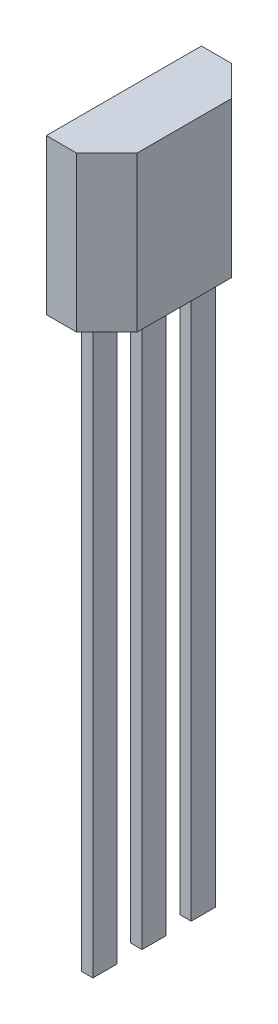
ISO-10303-21;
HEADER;
FILE_DESCRIPTION(('STEP AP214'),'2;1');
FILE_NAME('part.step','',(''),(''),'','','');
FILE_SCHEMA(('AUTOMOTIVE_DESIGN { 1 0 10303 214 1 1 1 1 }'));
ENDSEC;
DATA;
#1=APPLICATION_CONTEXT('core data for automotive mechanical design processes');
#2=APPLICATION_PROTOCOL_DEFINITION('international standard','automotive_design',2000,#1);
#3=PRODUCT_CONTEXT('',#1,'mechanical');
#4=PRODUCT('Part','Part','',(#3));
#5=PRODUCT_RELATED_PRODUCT_CATEGORY('part','',(#4));
#6=PRODUCT_DEFINITION_FORMATION('','',#4);
#7=PRODUCT_DEFINITION_CONTEXT('part definition',#1,'design');
#8=PRODUCT_DEFINITION('design','',#6,#7);
#9=PRODUCT_DEFINITION_SHAPE('','',#8);
#10=(LENGTH_UNIT() NAMED_UNIT(*) SI_UNIT(.MILLI.,.METRE.));
#11=(NAMED_UNIT(*) PLANE_ANGLE_UNIT() SI_UNIT($,.RADIAN.));
#12=(NAMED_UNIT(*) SI_UNIT($,.STERADIAN.) SOLID_ANGLE_UNIT());
#13=UNCERTAINTY_MEASURE_WITH_UNIT(LENGTH_MEASURE(1.E-05),#10,'distance_accuracy_value','');
#14=(GEOMETRIC_REPRESENTATION_CONTEXT(3) GLOBAL_UNCERTAINTY_ASSIGNED_CONTEXT((#13)) GLOBAL_UNIT_ASSIGNED_CONTEXT((#10,
#11,#12)) REPRESENTATION_CONTEXT('',''));
#15=CARTESIAN_POINT('',(0.,0.,0.));
#16=DIRECTION('',(0.,0.,1.));
#17=DIRECTION('',(1.,0.,0.));
#18=AXIS2_PLACEMENT_3D('',#15,#16,#17);
#19=CARTESIAN_POINT('',(0.,-1.7,0.));
#20=DIRECTION('',(0.,1.,0.));
#21=DIRECTION('',(0.,0.,1.));
#22=AXIS2_PLACEMENT_3D('',#19,#20,#21);
#23=PLANE('',#22);
#24=DIRECTION('',(1.,0.,0.));
#25=VECTOR('',#24,1.);
#26=CARTESIAN_POINT('',(0.499999999999996,-1.7,0.98));
#27=LINE('',#26,#25);
#28=CARTESIAN_POINT('',(0.499999999999996,-1.7,0.98));
#29=VERTEX_POINT('',#28);
#30=CARTESIAN_POINT('',(0.799999999999996,-1.7,0.98));
#31=VERTEX_POINT('',#30);
#32=EDGE_CURVE('E180',#29,#31,#27,.T.);
#33=ORIENTED_EDGE('',*,*,#32,.F.);
#34=DIRECTION('',(0.,0.,-1.));
#35=VECTOR('',#34,1.);
#36=CARTESIAN_POINT('',(0.499999999999996,-1.7,1.62));
#37=LINE('',#36,#35);
#38=CARTESIAN_POINT('',(0.499999999999996,-1.7,1.62));
#39=VERTEX_POINT('',#38);
#40=EDGE_CURVE('E193',#39,#29,#37,.T.);
#41=ORIENTED_EDGE('',*,*,#40,.F.);
#42=DIRECTION('',(-1.,0.,0.));
#43=VECTOR('',#42,1.);
#44=CARTESIAN_POINT('',(0.499999999999996,-1.7,1.62));
#45=LINE('',#44,#43);
#46=CARTESIAN_POINT('',(0.799999999999996,-1.7,1.62));
#47=VERTEX_POINT('',#46);
#48=EDGE_CURVE('E202',#47,#39,#45,.T.);
#49=ORIENTED_EDGE('',*,*,#48,.F.);
#50=DIRECTION('',(0.,0.,1.));
#51=VECTOR('',#50,1.);
#52=CARTESIAN_POINT('',(0.799999999999996,-1.7,1.62));
#53=LINE('',#52,#51);
#54=EDGE_CURVE('E183',#31,#47,#53,.T.);
#55=ORIENTED_EDGE('',*,*,#54,.F.);
#56=EDGE_LOOP('',(#33,#41,#49,#55));
#57=FACE_BOUND('',#56,.T.);
#58=DIRECTION('',(0.,0.,1.));
#59=VECTOR('',#58,1.);
#60=CARTESIAN_POINT('',(0.,-1.7,-2.05));
#61=LINE('',#60,#59);
#62=CARTESIAN_POINT('',(0.,-1.7,-2.05));
#63=VERTEX_POINT('',#62);
#64=CARTESIAN_POINT('',(0.,-1.7,2.05));
#65=VERTEX_POINT('',#64);
#66=EDGE_CURVE('E269',#63,#65,#61,.T.);
#67=ORIENTED_EDGE('',*,*,#66,.F.);
#68=DIRECTION('',(-1.,0.,0.));
#69=VECTOR('',#68,1.);
#70=CARTESIAN_POINT('',(0.,-1.7,-2.05));
#71=LINE('',#70,#69);
#72=CARTESIAN_POINT('',(0.799999999999996,-1.7,-2.05));
#73=VERTEX_POINT('',#72);
#74=EDGE_CURVE('E284',#73,#63,#71,.T.);
#75=ORIENTED_EDGE('',*,*,#74,.F.);
#76=DIRECTION('',(-0.707106781186549,0.,-0.707106781186546));
#77=VECTOR('',#76,1.);
#78=CARTESIAN_POINT('',(0.799999999999996,-1.7,-2.05));
#79=LINE('',#78,#77);
#80=CARTESIAN_POINT('',(1.6,-1.7,-1.25));
#81=VERTEX_POINT('',#80);
#82=EDGE_CURVE('E281',#81,#73,#79,.T.);
#83=ORIENTED_EDGE('',*,*,#82,.F.);
#84=DIRECTION('',(0.,0.,-1.));
#85=VECTOR('',#84,1.);
#86=CARTESIAN_POINT('',(1.6,-1.7,-1.25));
#87=LINE('',#86,#85);
#88=CARTESIAN_POINT('',(1.6,-1.7,1.25));
#89=VERTEX_POINT('',#88);
#90=EDGE_CURVE('E278',#89,#81,#87,.T.);
#91=ORIENTED_EDGE('',*,*,#90,.F.);
#92=DIRECTION('',(0.707106781186549,0.,-0.707106781186547));
#93=VECTOR('',#92,1.);
#94=CARTESIAN_POINT('',(1.6,-1.7,1.25));
#95=LINE('',#94,#93);
#96=CARTESIAN_POINT('',(0.799999999999997,-1.7,2.05));
#97=VERTEX_POINT('',#96);
#98=EDGE_CURVE('E275',#97,#89,#95,.T.);
#99=ORIENTED_EDGE('',*,*,#98,.F.);
#100=DIRECTION('',(1.,0.,0.));
#101=VECTOR('',#100,1.);
#102=CARTESIAN_POINT('',(0.,-1.7,2.05));
#103=LINE('',#102,#101);
#104=EDGE_CURVE('E272',#65,#97,#103,.T.);
#105=ORIENTED_EDGE('',*,*,#104,.F.);
#106=EDGE_LOOP('',(#67,#75,#83,#91,#99,#105));
#107=FACE_BOUND('',#106,.T.);
#108=DIRECTION('',(0.,0.,1.));
#109=VECTOR('',#108,1.);
#110=CARTESIAN_POINT('',(0.799999999999996,-1.7,0.32));
#111=LINE('',#110,#109);
#112=CARTESIAN_POINT('',(0.799999999999996,-1.7,-0.32));
#113=VERTEX_POINT('',#112);
#114=CARTESIAN_POINT('',(0.799999999999996,-1.7,0.32));
#115=VERTEX_POINT('',#114);
#116=EDGE_CURVE('E218',#113,#115,#111,.T.);
#117=ORIENTED_EDGE('',*,*,#116,.F.);
#118=DIRECTION('',(1.,0.,0.));
#119=VECTOR('',#118,1.);
#120=CARTESIAN_POINT('',(0.499999999999996,-1.7,-0.32));
#121=LINE('',#120,#119);
#122=CARTESIAN_POINT('',(0.499999999999996,-1.7,-0.32));
#123=VERTEX_POINT('',#122);
#124=EDGE_CURVE('E223',#123,#113,#121,.T.);
#125=ORIENTED_EDGE('',*,*,#124,.F.);
#126=DIRECTION('',(0.,0.,-1.));
#127=VECTOR('',#126,1.);
#128=CARTESIAN_POINT('',(0.499999999999996,-1.7,0.32));
#129=LINE('',#128,#127);
#130=CARTESIAN_POINT('',(0.499999999999996,-1.7,0.32));
#131=VERTEX_POINT('',#130);
#132=EDGE_CURVE('E235',#131,#123,#129,.T.);
#133=ORIENTED_EDGE('',*,*,#132,.F.);
#134=DIRECTION('',(-1.,0.,0.));
#135=VECTOR('',#134,1.);
#136=CARTESIAN_POINT('',(0.499999999999996,-1.7,0.32));
#137=LINE('',#136,#135);
#138=EDGE_CURVE('E232',#115,#131,#137,.T.);
#139=ORIENTED_EDGE('',*,*,#138,.F.);
#140=EDGE_LOOP('',(#117,#125,#133,#139));
#141=FACE_BOUND('',#140,.T.);
#142=DIRECTION('',(1.,0.,0.));
#143=VECTOR('',#142,1.);
#144=CARTESIAN_POINT('',(0.499999999999996,-1.7,-1.62));
#145=LINE('',#144,#143);
#146=CARTESIAN_POINT('',(0.499999999999996,-1.7,-1.62));
#147=VERTEX_POINT('',#146);
#148=CARTESIAN_POINT('',(0.799999999999996,-1.7,-1.62));
#149=VERTEX_POINT('',#148);
#150=EDGE_CURVE('E179',#147,#149,#145,.T.);
#151=ORIENTED_EDGE('',*,*,#150,.F.);
#152=DIRECTION('',(0.,0.,-1.));
#153=VECTOR('',#152,1.);
#154=CARTESIAN_POINT('',(0.499999999999996,-1.7,-0.98));
#155=LINE('',#154,#153);
#156=CARTESIAN_POINT('',(0.499999999999996,-1.7,-0.98));
#157=VERTEX_POINT('',#156);
#158=EDGE_CURVE('E176',#157,#147,#155,.T.);
#159=ORIENTED_EDGE('',*,*,#158,.F.);
#160=DIRECTION('',(-1.,0.,0.));
#161=VECTOR('',#160,1.);
#162=CARTESIAN_POINT('',(0.499999999999996,-1.7,-0.98));
#163=LINE('',#162,#161);
#164=CARTESIAN_POINT('',(0.799999999999996,-1.7,-0.98));
#165=VERTEX_POINT('',#164);
#166=EDGE_CURVE('E55',#165,#157,#163,.T.);
#167=ORIENTED_EDGE('',*,*,#166,.F.);
#168=DIRECTION('',(0.,0.,1.));
#169=VECTOR('',#168,1.);
#170=CARTESIAN_POINT('',(0.799999999999996,-1.7,-0.98));
#171=LINE('',#170,#169);
#172=EDGE_CURVE('E50',#149,#165,#171,.T.);
#173=ORIENTED_EDGE('',*,*,#172,.F.);
#174=EDGE_LOOP('',(#151,#159,#167,#173));
#175=FACE_BOUND('',#174,.T.);
#176=ADVANCED_FACE('F33',(#57,#107,#141,#175),#23,.F.);
#177=CARTESIAN_POINT('',(0.,-1.7,-2.05));
#178=DIRECTION('',(-1.,0.,0.));
#179=DIRECTION('',(0.,0.,1.));
#180=AXIS2_PLACEMENT_3D('',#177,#178,#179);
#181=PLANE('',#180);
#182=DIRECTION('',(0.,1.,0.));
#183=VECTOR('',#182,1.);
#184=CARTESIAN_POINT('',(0.,-1.7,2.05));
#185=LINE('',#184,#183);
#186=CARTESIAN_POINT('',(0.,2.4,2.05));
#187=VERTEX_POINT('',#186);
#188=EDGE_CURVE('E37',#65,#187,#185,.T.);
#189=ORIENTED_EDGE('',*,*,#188,.T.);
#190=DIRECTION('',(0.,0.,1.));
#191=VECTOR('',#190,1.);
#192=CARTESIAN_POINT('',(0.,2.4,-2.05));
#193=LINE('',#192,#191);
#194=CARTESIAN_POINT('',(0.,2.4,-2.05));
#195=VERTEX_POINT('',#194);
#196=EDGE_CURVE('E251',#195,#187,#193,.T.);
#197=ORIENTED_EDGE('',*,*,#196,.F.);
#198=DIRECTION('',(0.,1.,0.));
#199=VECTOR('',#198,1.);
#200=CARTESIAN_POINT('',(0.,-1.7,-2.05));
#201=LINE('',#200,#199);
#202=EDGE_CURVE('E11',#63,#195,#201,.T.);
#203=ORIENTED_EDGE('',*,*,#202,.F.);
#204=ORIENTED_EDGE('',*,*,#66,.T.);
#205=EDGE_LOOP('',(#189,#197,#203,#204));
#206=FACE_BOUND('',#205,.T.);
#207=ADVANCED_FACE('F35',(#206),#181,.T.);
#208=CARTESIAN_POINT('',(0.,-1.7,-2.05));
#209=DIRECTION('',(0.,0.,-1.));
#210=DIRECTION('',(-1.,0.,0.));
#211=AXIS2_PLACEMENT_3D('',#208,#209,#210);
#212=PLANE('',#211);
#213=ORIENTED_EDGE('',*,*,#202,.T.);
#214=DIRECTION('',(-1.,0.,0.));
#215=VECTOR('',#214,1.);
#216=CARTESIAN_POINT('',(0.,2.4,-2.05));
#217=LINE('',#216,#215);
#218=CARTESIAN_POINT('',(0.799999999999996,2.4,-2.05));
#219=VERTEX_POINT('',#218);
#220=EDGE_CURVE('E266',#219,#195,#217,.T.);
#221=ORIENTED_EDGE('',*,*,#220,.F.);
#222=DIRECTION('',(0.,1.,0.));
#223=VECTOR('',#222,1.);
#224=CARTESIAN_POINT('',(0.799999999999996,-1.7,-2.05));
#225=LINE('',#224,#223);
#226=EDGE_CURVE('E42',#73,#219,#225,.T.);
#227=ORIENTED_EDGE('',*,*,#226,.F.);
#228=ORIENTED_EDGE('',*,*,#74,.T.);
#229=EDGE_LOOP('',(#213,#221,#227,#228));
#230=FACE_BOUND('',#229,.T.);
#231=ADVANCED_FACE('F305',(#230),#212,.T.);
#232=CARTESIAN_POINT('',(0.799999999999996,-1.7,-2.05));
#233=DIRECTION('',(0.707106781186546,0.,-0.707106781186549));
#234=DIRECTION('',(-0.707106781186549,0.,-0.707106781186546));
#235=AXIS2_PLACEMENT_3D('',#232,#233,#234);
#236=PLANE('',#235);
#237=ORIENTED_EDGE('',*,*,#226,.T.);
#238=DIRECTION('',(-0.707106781186549,0.,-0.707106781186546));
#239=VECTOR('',#238,1.);
#240=CARTESIAN_POINT('',(0.799999999999996,2.4,-2.05));
#241=LINE('',#240,#239);
#242=CARTESIAN_POINT('',(1.6,2.4,-1.25));
#243=VERTEX_POINT('',#242);
#244=EDGE_CURVE('E263',#243,#219,#241,.T.);
#245=ORIENTED_EDGE('',*,*,#244,.F.);
#246=DIRECTION('',(0.,1.,0.));
#247=VECTOR('',#246,1.);
#248=CARTESIAN_POINT('',(1.6,-1.7,-1.25));
#249=LINE('',#248,#247);
#250=EDGE_CURVE('E288',#81,#243,#249,.T.);
#251=ORIENTED_EDGE('',*,*,#250,.F.);
#252=ORIENTED_EDGE('',*,*,#82,.T.);
#253=EDGE_LOOP('',(#237,#245,#251,#252));
#254=FACE_BOUND('',#253,.T.);
#255=ADVANCED_FACE('F318',(#254),#236,.T.);
#256=CARTESIAN_POINT('',(1.6,-1.7,-1.25));
#257=DIRECTION('',(1.,0.,0.));
#258=DIRECTION('',(0.,0.,-1.));
#259=AXIS2_PLACEMENT_3D('',#256,#257,#258);
#260=PLANE('',#259);
#261=ORIENTED_EDGE('',*,*,#250,.T.);
#262=DIRECTION('',(0.,0.,-1.));
#263=VECTOR('',#262,1.);
#264=CARTESIAN_POINT('',(1.6,2.4,-1.25));
#265=LINE('',#264,#263);
#266=CARTESIAN_POINT('',(1.6,2.4,1.25));
#267=VERTEX_POINT('',#266);
#268=EDGE_CURVE('E260',#267,#243,#265,.T.);
#269=ORIENTED_EDGE('',*,*,#268,.F.);
#270=DIRECTION('',(0.,1.,0.));
#271=VECTOR('',#270,1.);
#272=CARTESIAN_POINT('',(1.6,-1.7,1.25));
#273=LINE('',#272,#271);
#274=EDGE_CURVE('E290',#89,#267,#273,.T.);
#275=ORIENTED_EDGE('',*,*,#274,.F.);
#276=ORIENTED_EDGE('',*,*,#90,.T.);
#277=EDGE_LOOP('',(#261,#269,#275,#276));
#278=FACE_BOUND('',#277,.T.);
#279=ADVANCED_FACE('F316',(#278),#260,.T.);
#280=CARTESIAN_POINT('',(1.6,-1.7,1.25));
#281=DIRECTION('',(0.707106781186547,0.,0.707106781186548));
#282=DIRECTION('',(0.707106781186548,0.,-0.707106781186547));
#283=AXIS2_PLACEMENT_3D('',#280,#281,#282);
#284=PLANE('',#283);
#285=ORIENTED_EDGE('',*,*,#274,.T.);
#286=DIRECTION('',(0.707106781186549,0.,-0.707106781186547));
#287=VECTOR('',#286,1.);
#288=CARTESIAN_POINT('',(1.6,2.4,1.25));
#289=LINE('',#288,#287);
#290=CARTESIAN_POINT('',(0.799999999999997,2.4,2.05));
#291=VERTEX_POINT('',#290);
#292=EDGE_CURVE('E257',#291,#267,#289,.T.);
#293=ORIENTED_EDGE('',*,*,#292,.F.);
#294=DIRECTION('',(0.,1.,0.));
#295=VECTOR('',#294,1.);
#296=CARTESIAN_POINT('',(0.799999999999997,-1.7,2.05));
#297=LINE('',#296,#295);
#298=EDGE_CURVE('E291',#97,#291,#297,.T.);
#299=ORIENTED_EDGE('',*,*,#298,.F.);
#300=ORIENTED_EDGE('',*,*,#98,.T.);
#301=EDGE_LOOP('',(#285,#293,#299,#300));
#302=FACE_BOUND('',#301,.T.);
#303=ADVANCED_FACE('F313',(#302),#284,.T.);
#304=CARTESIAN_POINT('',(0.,-1.7,2.05));
#305=DIRECTION('',(0.,0.,1.));
#306=DIRECTION('',(1.,0.,0.));
#307=AXIS2_PLACEMENT_3D('',#304,#305,#306);
#308=PLANE('',#307);
#309=ORIENTED_EDGE('',*,*,#298,.T.);
#310=DIRECTION('',(1.,0.,0.));
#311=VECTOR('',#310,1.);
#312=CARTESIAN_POINT('',(0.,2.4,2.05));
#313=LINE('',#312,#311);
#314=EDGE_CURVE('E254',#187,#291,#313,.T.);
#315=ORIENTED_EDGE('',*,*,#314,.F.);
#316=ORIENTED_EDGE('',*,*,#188,.F.);
#317=ORIENTED_EDGE('',*,*,#104,.T.);
#318=EDGE_LOOP('',(#309,#315,#316,#317));
#319=FACE_BOUND('',#318,.T.);
#320=ADVANCED_FACE('F298',(#319),#308,.T.);
#321=CARTESIAN_POINT('',(0.,2.4,0.));
#322=DIRECTION('',(0.,1.,0.));
#323=DIRECTION('',(0.,0.,1.));
#324=AXIS2_PLACEMENT_3D('',#321,#322,#323);
#325=PLANE('',#324);
#326=ORIENTED_EDGE('',*,*,#196,.T.);
#327=ORIENTED_EDGE('',*,*,#314,.T.);
#328=ORIENTED_EDGE('',*,*,#292,.T.);
#329=ORIENTED_EDGE('',*,*,#268,.T.);
#330=ORIENTED_EDGE('',*,*,#244,.T.);
#331=ORIENTED_EDGE('',*,*,#220,.T.);
#332=EDGE_LOOP('',(#326,#327,#328,#329,#330,#331));
#333=FACE_BOUND('',#332,.T.);
#334=ADVANCED_FACE('F301',(#333),#325,.T.);
#335=CARTESIAN_POINT('',(0.799999999999996,-16.7,0.32));
#336=DIRECTION('',(-1.,0.,0.));
#337=DIRECTION('',(0.,0.,1.));
#338=AXIS2_PLACEMENT_3D('',#335,#336,#337);
#339=PLANE('',#338);
#340=ORIENTED_EDGE('',*,*,#116,.T.);
#341=DIRECTION('',(0.,1.,0.));
#342=VECTOR('',#341,1.);
#343=CARTESIAN_POINT('',(0.799999999999996,-16.7,0.32));
#344=LINE('',#343,#342);
#345=CARTESIAN_POINT('',(0.799999999999996,-16.7,0.32));
#346=VERTEX_POINT('',#345);
#347=EDGE_CURVE('E248',#346,#115,#344,.T.);
#348=ORIENTED_EDGE('',*,*,#347,.F.);
#349=DIRECTION('',(0.,0.,1.));
#350=VECTOR('',#349,1.);
#351=CARTESIAN_POINT('',(0.799999999999996,-16.7,0.32));
#352=LINE('',#351,#350);
#353=CARTESIAN_POINT('',(0.799999999999996,-16.7,-0.32));
#354=VERTEX_POINT('',#353);
#355=EDGE_CURVE('E219',#354,#346,#352,.T.);
#356=ORIENTED_EDGE('',*,*,#355,.F.);
#357=DIRECTION('',(0.,1.,0.));
#358=VECTOR('',#357,1.);
#359=CARTESIAN_POINT('',(0.799999999999996,-16.7,-0.32));
#360=LINE('',#359,#358);
#361=EDGE_CURVE('E229',#354,#113,#360,.T.);
#362=ORIENTED_EDGE('',*,*,#361,.T.);
#363=EDGE_LOOP('',(#340,#348,#356,#362));
#364=FACE_BOUND('',#363,.T.);
#365=ADVANCED_FACE('F336',(#364),#339,.F.);
#366=CARTESIAN_POINT('',(0.499999999999996,-16.7,0.32));
#367=DIRECTION('',(0.,0.,-1.));
#368=DIRECTION('',(-1.,0.,0.));
#369=AXIS2_PLACEMENT_3D('',#366,#367,#368);
#370=PLANE('',#369);
#371=ORIENTED_EDGE('',*,*,#138,.T.);
#372=DIRECTION('',(0.,1.,0.));
#373=VECTOR('',#372,1.);
#374=CARTESIAN_POINT('',(0.499999999999996,-16.7,0.32));
#375=LINE('',#374,#373);
#376=CARTESIAN_POINT('',(0.499999999999996,-16.7,0.32));
#377=VERTEX_POINT('',#376);
#378=EDGE_CURVE('E245',#377,#131,#375,.T.);
#379=ORIENTED_EDGE('',*,*,#378,.F.);
#380=DIRECTION('',(-1.,0.,0.));
#381=VECTOR('',#380,1.);
#382=CARTESIAN_POINT('',(0.499999999999996,-16.7,0.32));
#383=LINE('',#382,#381);
#384=EDGE_CURVE('E222',#346,#377,#383,.T.);
#385=ORIENTED_EDGE('',*,*,#384,.F.);
#386=ORIENTED_EDGE('',*,*,#347,.T.);
#387=EDGE_LOOP('',(#371,#379,#385,#386));
#388=FACE_BOUND('',#387,.T.);
#389=ADVANCED_FACE('F339',(#388),#370,.F.);
#390=CARTESIAN_POINT('',(0.499999999999996,-16.7,0.32));
#391=DIRECTION('',(1.,0.,0.));
#392=DIRECTION('',(0.,0.,-1.));
#393=AXIS2_PLACEMENT_3D('',#390,#391,#392);
#394=PLANE('',#393);
#395=ORIENTED_EDGE('',*,*,#132,.T.);
#396=DIRECTION('',(0.,1.,0.));
#397=VECTOR('',#396,1.);
#398=CARTESIAN_POINT('',(0.499999999999996,-16.7,-0.32));
#399=LINE('',#398,#397);
#400=CARTESIAN_POINT('',(0.499999999999996,-16.7,-0.32));
#401=VERTEX_POINT('',#400);
#402=EDGE_CURVE('E242',#401,#123,#399,.T.);
#403=ORIENTED_EDGE('',*,*,#402,.F.);
#404=DIRECTION('',(0.,0.,-1.));
#405=VECTOR('',#404,1.);
#406=CARTESIAN_POINT('',(0.499999999999996,-16.7,0.32));
#407=LINE('',#406,#405);
#408=EDGE_CURVE('E225',#377,#401,#407,.T.);
#409=ORIENTED_EDGE('',*,*,#408,.F.);
#410=ORIENTED_EDGE('',*,*,#378,.T.);
#411=EDGE_LOOP('',(#395,#403,#409,#410));
#412=FACE_BOUND('',#411,.T.);
#413=ADVANCED_FACE('F343',(#412),#394,.F.);
#414=CARTESIAN_POINT('',(0.499999999999996,-16.7,-0.32));
#415=DIRECTION('',(0.,0.,1.));
#416=DIRECTION('',(1.,0.,0.));
#417=AXIS2_PLACEMENT_3D('',#414,#415,#416);
#418=PLANE('',#417);
#419=ORIENTED_EDGE('',*,*,#124,.T.);
#420=ORIENTED_EDGE('',*,*,#361,.F.);
#421=DIRECTION('',(1.,0.,0.));
#422=VECTOR('',#421,1.);
#423=CARTESIAN_POINT('',(0.499999999999996,-16.7,-0.32));
#424=LINE('',#423,#422);
#425=EDGE_CURVE('E227',#401,#354,#424,.T.);
#426=ORIENTED_EDGE('',*,*,#425,.F.);
#427=ORIENTED_EDGE('',*,*,#402,.T.);
#428=EDGE_LOOP('',(#419,#420,#426,#427));
#429=FACE_BOUND('',#428,.T.);
#430=ADVANCED_FACE('F347',(#429),#418,.F.);
#431=CARTESIAN_POINT('',(0.,-16.7,0.));
#432=DIRECTION('',(0.,-1.,0.));
#433=DIRECTION('',(0.,0.,-1.));
#434=AXIS2_PLACEMENT_3D('',#431,#432,#433);
#435=PLANE('',#434);
#436=ORIENTED_EDGE('',*,*,#355,.T.);
#437=ORIENTED_EDGE('',*,*,#384,.T.);
#438=ORIENTED_EDGE('',*,*,#408,.T.);
#439=ORIENTED_EDGE('',*,*,#425,.T.);
#440=EDGE_LOOP('',(#436,#437,#438,#439));
#441=FACE_BOUND('',#440,.T.);
#442=ADVANCED_FACE('F351',(#441),#435,.T.);
#443=CARTESIAN_POINT('',(0.499999999999996,-16.7,0.98));
#444=DIRECTION('',(0.,0.,1.));
#445=DIRECTION('',(1.,0.,0.));
#446=AXIS2_PLACEMENT_3D('',#443,#444,#445);
#447=PLANE('',#446);
#448=ORIENTED_EDGE('',*,*,#32,.T.);
#449=DIRECTION('',(0.,1.,0.));
#450=VECTOR('',#449,1.);
#451=CARTESIAN_POINT('',(0.799999999999996,-16.7,0.98));
#452=LINE('',#451,#450);
#453=CARTESIAN_POINT('',(0.799999999999996,-16.7,0.98));
#454=VERTEX_POINT('',#453);
#455=EDGE_CURVE('E215',#454,#31,#452,.T.);
#456=ORIENTED_EDGE('',*,*,#455,.F.);
#457=DIRECTION('',(1.,0.,0.));
#458=VECTOR('',#457,1.);
#459=CARTESIAN_POINT('',(0.499999999999996,-16.7,0.98));
#460=LINE('',#459,#458);
#461=CARTESIAN_POINT('',(0.499999999999996,-16.7,0.98));
#462=VERTEX_POINT('',#461);
#463=EDGE_CURVE('E189',#462,#454,#460,.T.);
#464=ORIENTED_EDGE('',*,*,#463,.F.);
#465=DIRECTION('',(0.,1.,0.));
#466=VECTOR('',#465,1.);
#467=CARTESIAN_POINT('',(0.499999999999996,-16.7,0.98));
#468=LINE('',#467,#466);
#469=EDGE_CURVE('E198',#462,#29,#468,.T.);
#470=ORIENTED_EDGE('',*,*,#469,.T.);
#471=EDGE_LOOP('',(#448,#456,#464,#470));
#472=FACE_BOUND('',#471,.T.);
#473=ADVANCED_FACE('F355',(#472),#447,.F.);
#474=CARTESIAN_POINT('',(0.799999999999996,-16.7,1.62));
#475=DIRECTION('',(-1.,0.,0.));
#476=DIRECTION('',(0.,0.,1.));
#477=AXIS2_PLACEMENT_3D('',#474,#475,#476);
#478=PLANE('',#477);
#479=ORIENTED_EDGE('',*,*,#54,.T.);
#480=DIRECTION('',(0.,1.,0.));
#481=VECTOR('',#480,1.);
#482=CARTESIAN_POINT('',(0.799999999999996,-16.7,1.62));
#483=LINE('',#482,#481);
#484=CARTESIAN_POINT('',(0.799999999999996,-16.7,1.62));
#485=VERTEX_POINT('',#484);
#486=EDGE_CURVE('E212',#485,#47,#483,.T.);
#487=ORIENTED_EDGE('',*,*,#486,.F.);
#488=DIRECTION('',(0.,0.,1.));
#489=VECTOR('',#488,1.);
#490=CARTESIAN_POINT('',(0.799999999999996,-16.7,1.62));
#491=LINE('',#490,#489);
#492=EDGE_CURVE('E192',#454,#485,#491,.T.);
#493=ORIENTED_EDGE('',*,*,#492,.F.);
#494=ORIENTED_EDGE('',*,*,#455,.T.);
#495=EDGE_LOOP('',(#479,#487,#493,#494));
#496=FACE_BOUND('',#495,.T.);
#497=ADVANCED_FACE('F359',(#496),#478,.F.);
#498=CARTESIAN_POINT('',(0.499999999999996,-16.7,1.62));
#499=DIRECTION('',(0.,0.,-1.));
#500=DIRECTION('',(-1.,0.,0.));
#501=AXIS2_PLACEMENT_3D('',#498,#499,#500);
#502=PLANE('',#501);
#503=ORIENTED_EDGE('',*,*,#48,.T.);
#504=DIRECTION('',(0.,1.,0.));
#505=VECTOR('',#504,1.);
#506=CARTESIAN_POINT('',(0.499999999999996,-16.7,1.62));
#507=LINE('',#506,#505);
#508=CARTESIAN_POINT('',(0.499999999999996,-16.7,1.62));
#509=VERTEX_POINT('',#508);
#510=EDGE_CURVE('E209',#509,#39,#507,.T.);
#511=ORIENTED_EDGE('',*,*,#510,.F.);
#512=DIRECTION('',(-1.,0.,0.));
#513=VECTOR('',#512,1.);
#514=CARTESIAN_POINT('',(0.499999999999996,-16.7,1.62));
#515=LINE('',#514,#513);
#516=EDGE_CURVE('E195',#485,#509,#515,.T.);
#517=ORIENTED_EDGE('',*,*,#516,.F.);
#518=ORIENTED_EDGE('',*,*,#486,.T.);
#519=EDGE_LOOP('',(#503,#511,#517,#518));
#520=FACE_BOUND('',#519,.T.);
#521=ADVANCED_FACE('F363',(#520),#502,.F.);
#522=CARTESIAN_POINT('',(0.499999999999996,-16.7,1.62));
#523=DIRECTION('',(1.,0.,0.));
#524=DIRECTION('',(0.,0.,-1.));
#525=AXIS2_PLACEMENT_3D('',#522,#523,#524);
#526=PLANE('',#525);
#527=ORIENTED_EDGE('',*,*,#40,.T.);
#528=ORIENTED_EDGE('',*,*,#469,.F.);
#529=DIRECTION('',(0.,0.,-1.));
#530=VECTOR('',#529,1.);
#531=CARTESIAN_POINT('',(0.499999999999996,-16.7,1.62));
#532=LINE('',#531,#530);
#533=EDGE_CURVE('E197',#509,#462,#532,.T.);
#534=ORIENTED_EDGE('',*,*,#533,.F.);
#535=ORIENTED_EDGE('',*,*,#510,.T.);
#536=EDGE_LOOP('',(#527,#528,#534,#535));
#537=FACE_BOUND('',#536,.T.);
#538=ADVANCED_FACE('F367',(#537),#526,.F.);
#539=CARTESIAN_POINT('',(0.,-16.7,0.));
#540=DIRECTION('',(0.,1.,0.));
#541=DIRECTION('',(0.,0.,1.));
#542=AXIS2_PLACEMENT_3D('',#539,#540,#541);
#543=PLANE('',#542);
#544=ORIENTED_EDGE('',*,*,#463,.T.);
#545=ORIENTED_EDGE('',*,*,#492,.T.);
#546=ORIENTED_EDGE('',*,*,#516,.T.);
#547=ORIENTED_EDGE('',*,*,#533,.T.);
#548=EDGE_LOOP('',(#544,#545,#546,#547));
#549=FACE_BOUND('',#548,.T.);
#550=ADVANCED_FACE('F371',(#549),#543,.F.);
#551=CARTESIAN_POINT('',(0.499999999999996,-16.7,-1.62));
#552=DIRECTION('',(0.,0.,1.));
#553=DIRECTION('',(1.,0.,0.));
#554=AXIS2_PLACEMENT_3D('',#551,#552,#553);
#555=PLANE('',#554);
#556=ORIENTED_EDGE('',*,*,#150,.T.);
#557=DIRECTION('',(0.,1.,0.));
#558=VECTOR('',#557,1.);
#559=CARTESIAN_POINT('',(0.799999999999996,-16.7,-1.62));
#560=LINE('',#559,#558);
#561=CARTESIAN_POINT('',(0.799999999999996,-16.7,-1.62));
#562=VERTEX_POINT('',#561);
#563=EDGE_CURVE('E160',#562,#149,#560,.T.);
#564=ORIENTED_EDGE('',*,*,#563,.F.);
#565=DIRECTION('',(1.,0.,0.));
#566=VECTOR('',#565,1.);
#567=CARTESIAN_POINT('',(0.499999999999996,-16.7,-1.62));
#568=LINE('',#567,#566);
#569=CARTESIAN_POINT('',(0.499999999999996,-16.7,-1.62));
#570=VERTEX_POINT('',#569);
#571=EDGE_CURVE('E167',#570,#562,#568,.T.);
#572=ORIENTED_EDGE('',*,*,#571,.F.);
#573=DIRECTION('',(0.,1.,0.));
#574=VECTOR('',#573,1.);
#575=CARTESIAN_POINT('',(0.499999999999996,-16.7,-1.62));
#576=LINE('',#575,#574);
#577=EDGE_CURVE('E528',#570,#147,#576,.T.);
#578=ORIENTED_EDGE('',*,*,#577,.T.);
#579=EDGE_LOOP('',(#556,#564,#572,#578));
#580=FACE_BOUND('',#579,.T.);
#581=ADVANCED_FACE('F178',(#580),#555,.F.);
#582=CARTESIAN_POINT('',(0.799999999999996,-16.7,-0.98));
#583=DIRECTION('',(-1.,0.,0.));
#584=DIRECTION('',(0.,0.,1.));
#585=AXIS2_PLACEMENT_3D('',#582,#583,#584);
#586=PLANE('',#585);
#587=ORIENTED_EDGE('',*,*,#172,.T.);
#588=DIRECTION('',(0.,1.,0.));
#589=VECTOR('',#588,1.);
#590=CARTESIAN_POINT('',(0.799999999999996,-16.7,-0.98));
#591=LINE('',#590,#589);
#592=CARTESIAN_POINT('',(0.799999999999996,-16.7,-0.98));
#593=VERTEX_POINT('',#592);
#594=EDGE_CURVE('E163',#593,#165,#591,.T.);
#595=ORIENTED_EDGE('',*,*,#594,.F.);
#596=DIRECTION('',(0.,0.,1.));
#597=VECTOR('',#596,1.);
#598=CARTESIAN_POINT('',(0.799999999999996,-16.7,-0.98));
#599=LINE('',#598,#597);
#600=EDGE_CURVE('E156',#562,#593,#599,.T.);
#601=ORIENTED_EDGE('',*,*,#600,.F.);
#602=ORIENTED_EDGE('',*,*,#563,.T.);
#603=EDGE_LOOP('',(#587,#595,#601,#602));
#604=FACE_BOUND('',#603,.T.);
#605=ADVANCED_FACE('F158',(#604),#586,.F.);
#606=CARTESIAN_POINT('',(0.499999999999996,-16.7,-0.98));
#607=DIRECTION('',(0.,0.,-1.));
#608=DIRECTION('',(-1.,0.,0.));
#609=AXIS2_PLACEMENT_3D('',#606,#607,#608);
#610=PLANE('',#609);
#611=ORIENTED_EDGE('',*,*,#166,.T.);
#612=DIRECTION('',(0.,1.,0.));
#613=VECTOR('',#612,1.);
#614=CARTESIAN_POINT('',(0.499999999999996,-16.7,-0.98));
#615=LINE('',#614,#613);
#616=CARTESIAN_POINT('',(0.499999999999996,-16.7,-0.98));
#617=VERTEX_POINT('',#616);
#618=EDGE_CURVE('E185',#617,#157,#615,.T.);
#619=ORIENTED_EDGE('',*,*,#618,.F.);
#620=DIRECTION('',(-1.,0.,0.));
#621=VECTOR('',#620,1.);
#622=CARTESIAN_POINT('',(0.499999999999996,-16.7,-0.98));
#623=LINE('',#622,#621);
#624=EDGE_CURVE('E166',#593,#617,#623,.T.);
#625=ORIENTED_EDGE('',*,*,#624,.F.);
#626=ORIENTED_EDGE('',*,*,#594,.T.);
#627=EDGE_LOOP('',(#611,#619,#625,#626));
#628=FACE_BOUND('',#627,.T.);
#629=ADVANCED_FACE('F380',(#628),#610,.F.);
#630=CARTESIAN_POINT('',(0.499999999999996,-16.7,-0.98));
#631=DIRECTION('',(1.,0.,0.));
#632=DIRECTION('',(0.,0.,-1.));
#633=AXIS2_PLACEMENT_3D('',#630,#631,#632);
#634=PLANE('',#633);
#635=ORIENTED_EDGE('',*,*,#158,.T.);
#636=ORIENTED_EDGE('',*,*,#577,.F.);
#637=DIRECTION('',(0.,0.,-1.));
#638=VECTOR('',#637,1.);
#639=CARTESIAN_POINT('',(0.499999999999996,-16.7,-0.98));
#640=LINE('',#639,#638);
#641=EDGE_CURVE('E172',#617,#570,#640,.T.);
#642=ORIENTED_EDGE('',*,*,#641,.F.);
#643=ORIENTED_EDGE('',*,*,#618,.T.);
#644=EDGE_LOOP('',(#635,#636,#642,#643));
#645=FACE_BOUND('',#644,.T.);
#646=ADVANCED_FACE('F383',(#645),#634,.F.);
#647=CARTESIAN_POINT('',(0.,-16.7,0.));
#648=DIRECTION('',(0.,1.,0.));
#649=DIRECTION('',(0.,0.,1.));
#650=AXIS2_PLACEMENT_3D('',#647,#648,#649);
#651=PLANE('',#650);
#652=ORIENTED_EDGE('',*,*,#571,.T.);
#653=ORIENTED_EDGE('',*,*,#600,.T.);
#654=ORIENTED_EDGE('',*,*,#624,.T.);
#655=ORIENTED_EDGE('',*,*,#641,.T.);
#656=EDGE_LOOP('',(#652,#653,#654,#655));
#657=FACE_BOUND('',#656,.T.);
#658=ADVANCED_FACE('F170',(#657),#651,.F.);
#659=CLOSED_SHELL('',(#176,#207,#231,#255,#279,#303,#320,#334,#365,#389,#413,#430,#442,#473,
#497,#521,#538,#550,#581,#605,#629,#646,#658));
#660=MANIFOLD_SOLID_BREP('B2',#659);
#661=ADVANCED_BREP_SHAPE_REPRESENTATION('',(#18,#660),#14);
#662=SHAPE_DEFINITION_REPRESENTATION(#9,#661);
ENDSEC;
END-ISO-10303-21;
